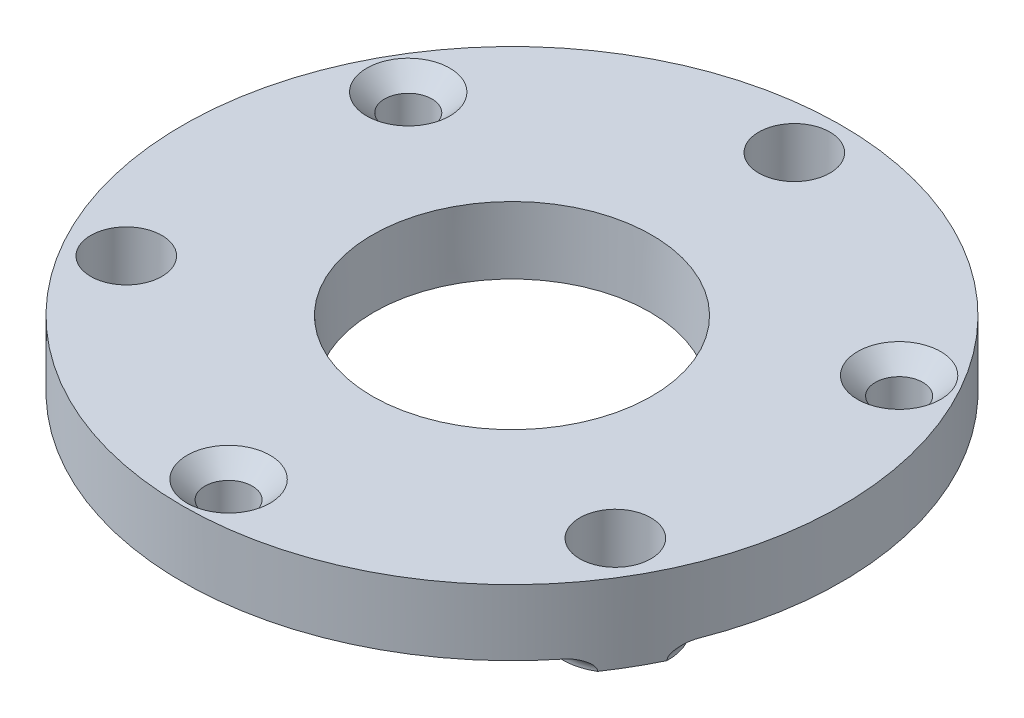
ISO-10303-21;
HEADER;
FILE_DESCRIPTION(('STEP AP214'),'2;1');
FILE_NAME('part.step','',(''),(''),'','','');
FILE_SCHEMA(('AUTOMOTIVE_DESIGN { 1 0 10303 214 1 1 1 1 }'));
ENDSEC;
DATA;
#1=APPLICATION_CONTEXT('core data for automotive mechanical design processes');
#2=APPLICATION_PROTOCOL_DEFINITION('international standard','automotive_design',2000,#1);
#3=PRODUCT_CONTEXT('',#1,'mechanical');
#4=PRODUCT('Part','Part','',(#3));
#5=PRODUCT_RELATED_PRODUCT_CATEGORY('part','',(#4));
#6=PRODUCT_DEFINITION_FORMATION('','',#4);
#7=PRODUCT_DEFINITION_CONTEXT('part definition',#1,'design');
#8=PRODUCT_DEFINITION('design','',#6,#7);
#9=PRODUCT_DEFINITION_SHAPE('','',#8);
#10=(LENGTH_UNIT() NAMED_UNIT(*) SI_UNIT(.MILLI.,.METRE.));
#11=(NAMED_UNIT(*) PLANE_ANGLE_UNIT() SI_UNIT($,.RADIAN.));
#12=(NAMED_UNIT(*) SI_UNIT($,.STERADIAN.) SOLID_ANGLE_UNIT());
#13=UNCERTAINTY_MEASURE_WITH_UNIT(LENGTH_MEASURE(1.E-05),#10,'distance_accuracy_value','');
#14=(GEOMETRIC_REPRESENTATION_CONTEXT(3) GLOBAL_UNCERTAINTY_ASSIGNED_CONTEXT((#13)) GLOBAL_UNIT_ASSIGNED_CONTEXT((#10,
#11,#12)) REPRESENTATION_CONTEXT('',''));
#15=CARTESIAN_POINT('',(0.,0.,0.));
#16=DIRECTION('',(0.,0.,1.));
#17=DIRECTION('',(1.,0.,0.));
#18=AXIS2_PLACEMENT_3D('',#15,#16,#17);
#19=CARTESIAN_POINT('',(0.,0.,0.));
#20=DIRECTION('',(0.,1.,0.));
#21=DIRECTION('',(0.,0.,1.));
#22=AXIS2_PLACEMENT_3D('',#19,#20,#21);
#23=PLANE('',#22);
#24=CARTESIAN_POINT('',(-18.6195461813654,0.,-10.7500000000001));
#25=DIRECTION('',(0.,1.,0.));
#26=DIRECTION('',(0.,0.,1.));
#27=AXIS2_PLACEMENT_3D('',#24,#25,#26);
#28=CIRCLE('',#27,1.8);
#29=CARTESIAN_POINT('',(-18.6195461813654,0.,-8.95000000000009));
#30=VERTEX_POINT('',#29);
#31=EDGE_CURVE('E139',#30,#30,#28,.T.);
#32=ORIENTED_EDGE('',*,*,#31,.T.);
#33=EDGE_LOOP('',(#32));
#34=FACE_BOUND('',#33,.T.);
#35=CARTESIAN_POINT('',(18.6195461813655,0.,-10.7499999999998));
#36=DIRECTION('',(0.,1.,0.));
#37=DIRECTION('',(0.,0.,1.));
#38=AXIS2_PLACEMENT_3D('',#35,#36,#37);
#39=CIRCLE('',#38,1.8);
#40=CARTESIAN_POINT('',(18.6195461813655,0.,-8.94999999999983));
#41=VERTEX_POINT('',#40);
#42=EDGE_CURVE('E148',#41,#41,#39,.T.);
#43=ORIENTED_EDGE('',*,*,#42,.T.);
#44=EDGE_LOOP('',(#43));
#45=FACE_BOUND('',#44,.T.);
#46=CARTESIAN_POINT('',(0.,0.,21.5));
#47=DIRECTION('',(0.,1.,0.));
#48=DIRECTION('',(0.,0.,1.));
#49=AXIS2_PLACEMENT_3D('',#46,#47,#48);
#50=CIRCLE('',#49,1.8);
#51=CARTESIAN_POINT('',(0.,0.,23.3));
#52=VERTEX_POINT('',#51);
#53=EDGE_CURVE('E157',#52,#52,#50,.T.);
#54=ORIENTED_EDGE('',*,*,#53,.T.);
#55=EDGE_LOOP('',(#54));
#56=FACE_BOUND('',#55,.T.);
#57=CARTESIAN_POINT('',(0.,0.,0.));
#58=DIRECTION('',(0.,1.,0.));
#59=DIRECTION('',(0.,0.,1.));
#60=AXIS2_PLACEMENT_3D('',#57,#58,#59);
#61=CIRCLE('',#60,10.4690703921541);
#62=CARTESIAN_POINT('',(0.,0.,10.4690703921541));
#63=VERTEX_POINT('',#62);
#64=EDGE_CURVE('E163',#63,#63,#61,.T.);
#65=ORIENTED_EDGE('',*,*,#64,.T.);
#66=EDGE_LOOP('',(#65));
#67=FACE_BOUND('',#66,.T.);
#68=CARTESIAN_POINT('',(0.,0.,0.));
#69=DIRECTION('',(0.,1.,0.));
#70=DIRECTION('',(0.,0.,1.));
#71=AXIS2_PLACEMENT_3D('',#68,#69,#70);
#72=CIRCLE('',#71,25.);
#73=CARTESIAN_POINT('',(-3.76018694612368,0.,-24.7156022408964));
#74=VERTEX_POINT('',#73);
#75=CARTESIAN_POINT('',(-23.2844328835088,0.,9.10138370212869));
#76=VERTEX_POINT('',#75);
#77=EDGE_CURVE('E170',#74,#76,#72,.T.);
#78=ORIENTED_EDGE('',*,*,#77,.F.);
#79=CARTESIAN_POINT('',(0.,0.,-21.42));
#80=DIRECTION('',(0.,1.,0.));
#81=DIRECTION('',(0.,0.,1.));
#82=AXIS2_PLACEMENT_3D('',#79,#80,#81);
#83=CIRCLE('',#82,5.);
#84=CARTESIAN_POINT('',(3.76018694612368,0.,-24.7156022408964));
#85=VERTEX_POINT('',#84);
#86=EDGE_CURVE('E184',#74,#85,#83,.T.);
#87=ORIENTED_EDGE('',*,*,#86,.T.);
#88=CARTESIAN_POINT('',(23.2844328835106,0.,9.10138370212421));
#89=VERTEX_POINT('',#88);
#90=EDGE_CURVE('E98',#89,#85,#72,.T.);
#91=ORIENTED_EDGE('',*,*,#90,.F.);
#92=CARTESIAN_POINT('',(18.550264149064,0.,10.7099999999992));
#93=DIRECTION('',(0.,1.,0.));
#94=DIRECTION('',(0.,0.,1.));
#95=AXIS2_PLACEMENT_3D('',#92,#93,#94);
#96=CIRCLE('',#95,5.);
#97=CARTESIAN_POINT('',(19.5242459373865,0.,15.6142185387693));
#98=VERTEX_POINT('',#97);
#99=EDGE_CURVE('E182',#89,#98,#96,.T.);
#100=ORIENTED_EDGE('',*,*,#99,.T.);
#101=CARTESIAN_POINT('',(-19.5242459373855,0.,15.6142185387705));
#102=VERTEX_POINT('',#101);
#103=EDGE_CURVE('E179',#102,#98,#72,.T.);
#104=ORIENTED_EDGE('',*,*,#103,.F.);
#105=CARTESIAN_POINT('',(-18.5502641490613,0.,10.7100000000008));
#106=DIRECTION('',(0.,1.,0.));
#107=DIRECTION('',(0.,0.,1.));
#108=AXIS2_PLACEMENT_3D('',#105,#106,#107);
#109=CIRCLE('',#108,5.);
#110=EDGE_CURVE('E55',#102,#76,#109,.T.);
#111=ORIENTED_EDGE('',*,*,#110,.T.);
#112=EDGE_LOOP('',(#78,#87,#91,#100,#104,#111));
#113=FACE_BOUND('',#112,.T.);
#114=ADVANCED_FACE('F34',(#34,#45,#56,#67,#113),#23,.F.);
#115=CARTESIAN_POINT('',(0.,5.,0.));
#116=DIRECTION('',(0.,-1.,0.));
#117=DIRECTION('',(0.,0.,-1.));
#118=AXIS2_PLACEMENT_3D('',#115,#116,#117);
#119=CYLINDRICAL_SURFACE('',#118,25.);
#120=CARTESIAN_POINT('',(0.,5.,0.));
#121=DIRECTION('',(0.,1.,0.));
#122=DIRECTION('',(0.,0.,1.));
#123=AXIS2_PLACEMENT_3D('',#120,#121,#122);
#124=CIRCLE('',#123,25.);
#125=CARTESIAN_POINT('',(0.,5.,25.));
#126=VERTEX_POINT('',#125);
#127=EDGE_CURVE('E176',#126,#126,#124,.T.);
#128=ORIENTED_EDGE('',*,*,#127,.F.);
#129=EDGE_LOOP('',(#128));
#130=FACE_BOUND('',#129,.T.);
#131=CARTESIAN_POINT('',(0.,-1.,0.));
#132=DIRECTION('',(0.,-1.,0.));
#133=DIRECTION('',(0.,0.,-1.));
#134=AXIS2_PLACEMENT_3D('',#131,#132,#133);
#135=CIRCLE('',#134,25.);
#136=CARTESIAN_POINT('',(-20.6231882535034,-1.,14.1309626798941));
#137=VERTEX_POINT('',#136);
#138=CARTESIAN_POINT('',(-22.5493667874685,-1.,10.7947235946186));
#139=VERTEX_POINT('',#138);
#140=EDGE_CURVE('E127',#137,#139,#135,.T.);
#141=ORIENTED_EDGE('',*,*,#140,.F.);
#142=CARTESIAN_POINT('',(-20.6231882535034,-1.,14.1309626798941));
#143=CARTESIAN_POINT('',(-20.6232350944953,-0.973586965462332,14.1308922829923));
#144=CARTESIAN_POINT('',(-20.621756593342,-0.947296299769171,14.1330522226527));
#145=CARTESIAN_POINT('',(-20.6162031936346,-0.89595550807268,14.1411528449473));
#146=CARTESIAN_POINT('',(-20.6121655302788,-0.870893054901191,14.1470393061422));
#147=CARTESIAN_POINT('',(-20.6003906441305,-0.814921682100689,14.164181377551));
#148=CARTESIAN_POINT('',(-20.5919072137914,-0.784512498212255,14.1765175616493));
#149=CARTESIAN_POINT('',(-20.5722910653188,-0.726290293248973,14.2049690124696));
#150=CARTESIAN_POINT('',(-20.5611415891279,-0.698495309685433,14.2211081739575));
#151=CARTESIAN_POINT('',(-20.5276601299499,-0.624903732852702,14.2694275116065));
#152=CARTESIAN_POINT('',(-20.5033562217446,-0.581841465922802,14.304349034202));
#153=CARTESIAN_POINT('',(-20.451427798709,-0.501997376217426,14.3784971630185));
#154=CARTESIAN_POINT('',(-20.4237955466699,-0.465230687827921,14.4177337811526));
#155=CARTESIAN_POINT('',(-20.3659035195638,-0.396294156106442,14.4993969639317));
#156=CARTESIAN_POINT('',(-20.3356132956352,-0.364193110367113,14.5418594570174));
#157=CARTESIAN_POINT('',(-20.2732949484417,-0.304407753229898,14.6286148489697));
#158=CARTESIAN_POINT('',(-20.241265265362,-0.276727496711786,14.6729093818948));
#159=CARTESIAN_POINT('',(-20.1757708502732,-0.225362999381766,14.7628374514195));
#160=CARTESIAN_POINT('',(-20.1423042219954,-0.201684255960819,14.808472730612));
#161=CARTESIAN_POINT('',(-20.0741837697407,-0.158178103946163,14.9006856824353));
#162=CARTESIAN_POINT('',(-20.0395297919102,-0.138351196700223,14.9472634768722));
#163=CARTESIAN_POINT('',(-19.9661577347922,-0.100966885076888,15.0451520789649));
#164=CARTESIAN_POINT('',(-19.9273468816714,-0.0837526053495929,15.0965246797792));
#165=CARTESIAN_POINT('',(-19.8486828355108,-0.0539238776380615,15.1998028194117));
#166=CARTESIAN_POINT('',(-19.8088296634221,-0.0413093372730208,15.2517083475051));
#167=CARTESIAN_POINT('',(-19.7285545066535,-0.0209652223238633,15.3554028092382));
#168=CARTESIAN_POINT('',(-19.6881391165556,-0.0131993718503745,15.4071896482652));
#169=CARTESIAN_POINT('',(-19.6066395058371,-0.00272378398616917,15.5107723323731));
#170=CARTESIAN_POINT('',(-19.5655550621591,-1.57691514504377E-05,15.5625681745161));
#171=CARTESIAN_POINT('',(-19.5242459373855,0.,15.6142185387705));
#172=B_SPLINE_CURVE_WITH_KNOTS('',3,(#142,#143,#144,#145,#146,#147,#148,#149,#150,#151,#152,
#153,#154,#155,#156,#157,#158,#159,#160,#161,#162,#163,#164,#165,#166,#167,#168,#169,#170,#171),
.UNSPECIFIED.,.F.,.F.,(4,2,2,2,2,2,2,2,2,2,2,2,2,2,4),(0.,0.0789131914609894,0.15670377488966,
0.257815060886303,0.359579433631892,0.540175523590869,0.721199845096693,0.904669272695562,
1.08830602925819,1.27219305556915,1.45610400025844,1.6558735925121,1.85563917238795,
2.05389169381441,2.25221172214837),.UNSPECIFIED.);
#173=EDGE_CURVE('E48',#137,#102,#172,.T.);
#174=ORIENTED_EDGE('',*,*,#173,.T.);
#175=ORIENTED_EDGE('',*,*,#103,.T.);
#176=CARTESIAN_POINT('',(19.5242459373865,0.,15.6142185387693));
#177=CARTESIAN_POINT('',(19.5696093242938,-2.30517781126259E-05,15.5575000242535));
#178=CARTESIAN_POINT('',(19.6146981633579,-0.00328449148192498,15.5006092070901));
#179=CARTESIAN_POINT('',(19.7040511677425,-0.015869955559491,15.3868631895834));
#180=CARTESIAN_POINT('',(19.7483155028982,-0.025192716865045,15.3300079842894));
#181=CARTESIAN_POINT('',(19.8362951543023,-0.0496348155225064,15.2159999409611));
#182=CARTESIAN_POINT('',(19.8799972333065,-0.0648233155385237,15.1588519013263));
#183=CARTESIAN_POINT('',(19.9660690893839,-0.100741961117756,15.0453034189345));
#184=CARTESIAN_POINT('',(20.0084390091742,-0.121471510780434,14.9889028964715));
#185=CARTESIAN_POINT('',(20.0815330085732,-0.162721365085316,14.8907628591254));
#186=CARTESIAN_POINT('',(20.112592808361,-0.182076948347779,14.8487801620131));
#187=CARTESIAN_POINT('',(20.1736792967498,-0.224002476220827,14.7656804927788));
#188=CARTESIAN_POINT('',(20.2037061712246,-0.246571838718848,14.7245633654206));
#189=CARTESIAN_POINT('',(20.2624083225683,-0.29499222447442,14.6436776073568));
#190=CARTESIAN_POINT('',(20.2910894893762,-0.320826665257542,14.6039033669227));
#191=CARTESIAN_POINT('',(20.3469697044659,-0.376196535897639,14.5259463575848));
#192=CARTESIAN_POINT('',(20.3741698919496,-0.405729061706216,14.4877623708944));
#193=CARTESIAN_POINT('',(20.4209470141076,-0.462241643682785,14.4217262524109));
#194=CARTESIAN_POINT('',(20.4408981816535,-0.488386934686066,14.3934289351388));
#195=CARTESIAN_POINT('',(20.4792697543877,-0.543854506452894,14.3387804489017));
#196=CARTESIAN_POINT('',(20.4976867860959,-0.573183478149497,14.3124335823179));
#197=CARTESIAN_POINT('',(20.5324937415285,-0.635969338170467,14.2624554978299));
#198=CARTESIAN_POINT('',(20.5488548429191,-0.66947406633759,14.2388631641068));
#199=CARTESIAN_POINT('',(20.5779778729234,-0.740960332839187,14.1967418195328));
#200=CARTESIAN_POINT('',(20.5907557414962,-0.778920943219733,14.178190396085));
#201=CARTESIAN_POINT('',(20.6065169090233,-0.842327836831803,14.1552664448495));
#202=CARTESIAN_POINT('',(20.6113596377518,-0.866328262276174,14.148211660954));
#203=CARTESIAN_POINT('',(20.6186916974234,-0.915394799101256,14.1375244419198));
#204=CARTESIAN_POINT('',(20.6211884516745,-0.940457284943744,14.1338812118127));
#205=CARTESIAN_POINT('',(20.6229216935211,-0.977103783533508,14.1313516216154));
#206=CARTESIAN_POINT('',(20.6231948202059,-0.988553009443518,14.1309528675404));
#207=CARTESIAN_POINT('',(20.6231882535033,-1.,14.1309626798943));
#208=B_SPLINE_CURVE_WITH_KNOTS('',3,(#176,#177,#178,#179,#180,#181,#182,#183,#184,#185,#186,
#187,#188,#189,#190,#191,#192,#193,#194,#195,#196,#197,#198,#199,#200,#201,#202,#203,#204,#205,
#206,#207),.UNSPECIFIED.,.F.,.F.,(4,2,2,2,2,2,2,2,2,2,2,2,2,2,2,4),(0.,0.217759075910336,
0.435472789362352,0.655836044212712,0.876175610087974,1.04316265600238,1.2101194938986,
1.37626012868431,1.54227110453312,1.67229016059185,1.80258796265945,1.93454616343114,
2.06590768517885,2.14205925753355,2.21796904576488,2.25230945301693),.UNSPECIFIED.);
#209=CARTESIAN_POINT('',(20.6231882535033,-1.,14.1309626798943));
#210=VERTEX_POINT('',#209);
#211=EDGE_CURVE('E211',#98,#210,#208,.T.);
#212=ORIENTED_EDGE('',*,*,#211,.T.);
#213=CARTESIAN_POINT('',(0.,-1.,0.));
#214=DIRECTION('',(0.,-1.,0.));
#215=DIRECTION('',(0.,0.,-1.));
#216=AXIS2_PLACEMENT_3D('',#213,#214,#215);
#217=CIRCLE('',#216,25.);
#218=CARTESIAN_POINT('',(22.5493667874713,-1.,10.7947235946126));
#219=VERTEX_POINT('',#218);
#220=EDGE_CURVE('E115',#219,#210,#217,.T.);
#221=ORIENTED_EDGE('',*,*,#220,.F.);
#222=CARTESIAN_POINT('',(22.5493667874713,-1.,10.7947235946126));
#223=CARTESIAN_POINT('',(22.5493292424619,-0.973586965462293,10.7947993585525));
#224=CARTESIAN_POINT('',(22.5504605545018,-0.947296299769093,10.792438969164));
#225=CARTESIAN_POINT('',(22.5546991993417,-0.895955508072528,10.7835792727927));
#226=CARTESIAN_POINT('',(22.557778192597,-0.870893054901003,10.7771393231572));
#227=CARTESIAN_POINT('',(22.5667362188363,-0.814921682100421,10.7583709369217));
#228=CARTESIAN_POINT('',(22.5731779524817,-0.784512498211945,10.7448559786877));
#229=CARTESIAN_POINT('',(22.5880095574303,-0.72629029324858,10.7136421703758));
#230=CARTESIAN_POINT('',(22.5964117431792,-0.698495309685,10.6959168600117));
#231=CARTESIAN_POINT('',(22.6215167874882,-0.624903732852202,10.6427613969831));
#232=CARTESIAN_POINT('',(22.6396077590921,-0.581841465922274,10.6042528337684));
#233=CARTESIAN_POINT('',(22.6778577107725,-0.501997376216846,10.5222074358327));
#234=CARTESIAN_POINT('',(22.6980214928157,-0.465230687827317,10.478658894536));
#235=CARTESIAN_POINT('',(22.7397978701032,-0.39629415610585,10.387691336996));
#236=CARTESIAN_POINT('',(22.7614263558591,-0.364193110366551,10.3402279870447));
#237=CARTESIAN_POINT('',(22.8053995556083,-0.30440775322939,10.2428810192772));
#238=CARTESIAN_POINT('',(22.8277449048304,-0.276727496711302,10.1929952335925));
#239=CARTESIAN_POINT('',(22.8728776900076,-0.225362999381333,10.0913113715573));
#240=CARTESIAN_POINT('',(22.8956656869581,-0.201684255960412,10.0395107816936));
#241=CARTESIAN_POINT('',(22.9414642196677,-0.158178103945807,9.93441026361216));
#242=CARTESIAN_POINT('',(22.964474783987,-0.13835119669989,9.8811101412503));
#243=CARTESIAN_POINT('',(23.0125627715811,-0.100966885076626,9.768623774812));
#244=CARTESIAN_POINT('',(23.0376473223844,-0.0837526053493738,9.7093262896598));
#245=CARTESIAN_POINT('',(23.0877567918813,-0.0539238776379178,9.58956215750422));
#246=CARTESIAN_POINT('',(23.1127817117626,-0.0413093372729101,9.5290955340074));
#247=CARTESIAN_POINT('',(23.1624461714708,-0.0209652223238061,9.40772797808668));
#248=CARTESIAN_POINT('',(23.1870871946009,-0.0131993718503381,9.3468338040447));
#249=CARTESIAN_POINT('',(23.2360426250711,-0.00272378398616113,9.22446172871019));
#250=CARTESIAN_POINT('',(23.2603569183384,-1.576915145004E-05,9.16298363571335));
#251=CARTESIAN_POINT('',(23.2844328835106,0.,9.10138370212421));
#252=B_SPLINE_CURVE_WITH_KNOTS('',3,(#222,#223,#224,#225,#226,#227,#228,#229,#230,#231,#232,
#233,#234,#235,#236,#237,#238,#239,#240,#241,#242,#243,#244,#245,#246,#247,#248,#249,#250,#251),
.UNSPECIFIED.,.F.,.F.,(4,2,2,2,2,2,2,2,2,2,2,2,2,2,4),(0.,0.078913191461104,0.156703774889888,
0.257815060886667,0.359579433632392,0.540175523591477,0.721199845097408,0.904669272696121,
1.0883060292586,1.2721930555694,1.45610400025854,1.65587359251181,1.85563917238726,
2.05389169381335,2.25221172214692),.UNSPECIFIED.);
#253=EDGE_CURVE('E102',#219,#89,#252,.T.);
#254=ORIENTED_EDGE('',*,*,#253,.T.);
#255=ORIENTED_EDGE('',*,*,#90,.T.);
#256=CARTESIAN_POINT('',(3.76018694612368,0.,-24.7156022408964));
#257=CARTESIAN_POINT('',(3.68838557823435,-2.30517781123426E-05,-24.7265288291019));
#258=CARTESIAN_POINT('',(3.61657226579671,-0.00328449148192666,-24.7371315005769));
#259=CARTESIAN_POINT('',(3.47338882286424,-0.0158699555594999,-24.7576404635251));
#260=CARTESIAN_POINT('',(3.40201860316437,-0.0251927168650594,-24.7675468996045));
#261=CARTESIAN_POINT('',(3.2592949157042,-0.0496348155225337,-24.7867354910725));
#262=CARTESIAN_POINT('',(3.18795222210185,-0.0648233155385585,-24.7960085818709));
#263=CARTESIAN_POINT('',(3.04658042375055,-0.100741961117809,-24.8137747545889));
#264=CARTESIAN_POINT('',(2.9765511786157,-0.121471510780498,-24.8222679202521));
#265=CARTESIAN_POINT('',(2.85501241344601,-0.162721365085396,-24.8364991619228));
#266=CARTESIAN_POINT('',(2.80312443133352,-0.182076948347865,-24.8424063890194));
#267=CARTESIAN_POINT('',(2.70061476253606,-0.224002476220924,-24.8537590051749));
#268=CARTESIAN_POINT('',(2.64999284847582,-0.24657183871895,-24.8592044775873));
#269=CARTESIAN_POINT('',(2.55059265151623,-0.294992224474536,-24.8695991528758));
#270=CARTESIAN_POINT('',(2.50180656548015,-0.320826665257664,-24.8745506517246));
#271=CARTESIAN_POINT('',(2.40635370744557,-0.376196535897776,-24.8839658328922));
#272=CARTESIAN_POINT('',(2.35968531121205,-0.40572906170636,-24.8884298928956));
#273=CARTESIAN_POINT('',(2.27910779395895,-0.462241643682924,-24.8959220097586));
#274=CARTESIAN_POINT('',(2.24462601456947,-0.488386934686191,-24.8990515690524));
#275=CARTESIAN_POINT('',(2.17811325084268,-0.543854506452996,-24.9049580827049));
#276=CARTESIAN_POINT('',(2.14608767921686,-0.57318347814959,-24.9077342667346));
#277=CARTESIAN_POINT('',(2.08540191070147,-0.635969338170534,-24.9128889321237));
#278=CARTESIAN_POINT('',(2.05678979966742,-0.66947406633764,-24.9152618947002));
#279=CARTESIAN_POINT('',(2.00575013022263,-0.740960332839205,-24.9194225062322));
#280=CARTESIAN_POINT('',(1.98329519195406,-0.778920943219738,-24.9212127532986));
#281=CARTESIAN_POINT('',(1.9555618840654,-0.842327836831776,-24.9234003491525));
#282=CARTESIAN_POINT('',(1.9470308976294,-0.866328262276127,-24.9240668833073));
#283=CARTESIAN_POINT('',(1.93410946461424,-0.915394799101168,-24.9250730237278));
#284=CARTESIAN_POINT('',(1.9297059576641,-0.940457284943636,-24.9254136612828));
#285=CARTESIAN_POINT('',(1.92664864736875,-0.977103783533423,-24.9256498976542));
#286=CARTESIAN_POINT('',(1.92616675286756,-0.988553009443475,-24.9256870552642));
#287=CARTESIAN_POINT('',(1.9261785339666,-1.,-24.9256862745098));
#288=B_SPLINE_CURVE_WITH_KNOTS('',3,(#256,#257,#258,#259,#260,#261,#262,#263,#264,#265,#266,
#267,#268,#269,#270,#271,#272,#273,#274,#275,#276,#277,#278,#279,#280,#281,#282,#283,#284,#285,
#286,#287),.UNSPECIFIED.,.F.,.F.,(4,2,2,2,2,2,2,2,2,2,2,2,2,2,2,4),(0.,0.217759075910458,
0.4354727893626,0.655836044213085,0.876175610088471,1.04316265600296,1.21011949389925,
1.37626012868504,1.54227110453392,1.67229016059263,1.8025879626602,1.93454616343187,
2.06590768517956,2.1420592575342,2.21796904576548,2.25230945301765),.UNSPECIFIED.);
#289=CARTESIAN_POINT('',(1.92617853396656,-1.,-24.9256862745098));
#290=VERTEX_POINT('',#289);
#291=EDGE_CURVE('E92',#85,#290,#288,.T.);
#292=ORIENTED_EDGE('',*,*,#291,.T.);
#293=CARTESIAN_POINT('',(0.,-1.,0.));
#294=DIRECTION('',(0.,-1.,0.));
#295=DIRECTION('',(0.,0.,-1.));
#296=AXIS2_PLACEMENT_3D('',#293,#294,#295);
#297=CIRCLE('',#296,25.);
#298=CARTESIAN_POINT('',(-1.92617853396656,-1.,-24.9256862745098));
#299=VERTEX_POINT('',#298);
#300=EDGE_CURVE('E96',#299,#290,#297,.T.);
#301=ORIENTED_EDGE('',*,*,#300,.F.);
#302=CARTESIAN_POINT('',(-1.92617853396656,-1.,-24.9256862745098));
#303=CARTESIAN_POINT('',(-1.92609414796523,-0.973586965462312,-24.9256916415478));
#304=CARTESIAN_POINT('',(-1.92870396115848,-0.947296299769132,-24.9254911918198));
#305=CARTESIAN_POINT('',(-1.93849600570573,-0.895955508072604,-24.924732117743));
#306=CARTESIAN_POINT('',(-1.94561266231684,-0.870893054901097,-24.9241786293025));
#307=CARTESIAN_POINT('',(-1.9663455747045,-0.814921682100555,-24.9225523144757));
#308=CARTESIAN_POINT('',(-1.98127073868892,-0.7845124982121,-24.9213735403401));
#309=CARTESIAN_POINT('',(-2.01571849211018,-0.726290293248776,-24.9186111828485));
#310=CARTESIAN_POINT('',(-2.03527015404986,-0.698495309685216,-24.9170250339723));
#311=CARTESIAN_POINT('',(-2.09385665753702,-0.624903732852451,-24.9121889085928));
#312=CARTESIAN_POINT('',(-2.13625153734616,-0.581841465922538,-24.9086018679735));
#313=CARTESIAN_POINT('',(-2.22642991206222,-0.501997376217137,-24.9007045988545));
#314=CARTESIAN_POINT('',(-2.27422594614453,-0.465230687827619,-24.8963926756919));
#315=CARTESIAN_POINT('',(-2.37389435053811,-0.396294156106146,-24.887088300931));
#316=CARTESIAN_POINT('',(-2.42581306022264,-0.364193110366832,-24.8820874440653));
#317=CARTESIAN_POINT('',(-2.53210460716533,-0.304407753229644,-24.8714958682501));
#318=CARTESIAN_POINT('',(-2.58647963946707,-0.276727496711544,-24.8659046154905));
#319=CARTESIAN_POINT('',(-2.69710683973308,-0.22536299938155,-24.8541488229799));
#320=CARTESIAN_POINT('',(-2.75336146496139,-0.201684255960616,-24.8479835123086));
#321=CARTESIAN_POINT('',(-2.86728044992567,-0.158178103945986,-24.8350959460504));
#322=CARTESIAN_POINT('',(-2.92494499207555,-0.138351196700057,-24.8283736181254));
#323=CARTESIAN_POINT('',(-3.04640503678766,-0.100966885076757,-24.8137758537796));
#324=CARTESIAN_POINT('',(-3.11030044071167,-0.0837526053494844,-24.8058509694417));
#325=CARTESIAN_POINT('',(-3.2390739563692,-0.0539238776379912,-24.7893649769184));
#326=CARTESIAN_POINT('',(-3.30395204833922,-0.0413093372729667,-24.7808038815148));
#327=CARTESIAN_POINT('',(-3.43389166481602,-0.0209652223238352,-24.763130787327));
#328=CARTESIAN_POINT('',(-3.49894807804395,-0.0131993718503564,-24.7540234523119));
#329=CARTESIAN_POINT('',(-3.62940311923272,-0.00272378398616477,-24.7352340610851));
#330=CARTESIAN_POINT('',(-3.69480185617791,-1.57691514497965E-05,-24.7255518102312));
#331=CARTESIAN_POINT('',(-3.76018694612368,0.,-24.7156022408964));
#332=B_SPLINE_CURVE_WITH_KNOTS('',3,(#302,#303,#304,#305,#306,#307,#308,#309,#310,#311,#312,
#313,#314,#315,#316,#317,#318,#319,#320,#321,#322,#323,#324,#325,#326,#327,#328,#329,#330,#331),
.UNSPECIFIED.,.F.,.F.,(4,2,2,2,2,2,2,2,2,2,2,2,2,2,4),(0.,0.0789131914610469,0.156703774889774,
0.257815060886483,0.35957943363214,0.540175523591172,0.721199845097051,0.90466927269584,
1.08830602925839,1.27219305556928,1.45610400025849,1.65587359251195,1.8556391723876,
2.05389169381388,2.25221172214764),.UNSPECIFIED.);
#333=EDGE_CURVE('E62',#299,#74,#332,.T.);
#334=ORIENTED_EDGE('',*,*,#333,.T.);
#335=ORIENTED_EDGE('',*,*,#77,.T.);
#336=CARTESIAN_POINT('',(-23.2844328835088,0.,9.10138370212869));
#337=CARTESIAN_POINT('',(-23.2579949025268,-2.30517781125067E-05,9.16902880485011));
#338=CARTESIAN_POINT('',(-23.2312704291533,-0.00328449148192873,9.23652229348857));
#339=CARTESIAN_POINT('',(-23.1774399906054,-0.0158699555595092,9.37077727394357));
#340=CARTESIAN_POINT('',(-23.1503341060612,-0.0251927168650742,9.43753891531707));
#341=CARTESIAN_POINT('',(-23.0955900700052,-0.0496348155225627,9.57073555011345));
#342=CARTESIAN_POINT('',(-23.067949455407,-0.0648233155385962,9.63715668054671));
#343=CARTESIAN_POINT('',(-23.0126495131331,-0.100741961117863,9.7684713356567));
#344=CARTESIAN_POINT('',(-22.9849901877886,-0.12147151078056,9.83336502378297));
#345=CARTESIAN_POINT('',(-22.9365454220179,-0.162721365085474,9.94573630279993));
#346=CARTESIAN_POINT('',(-22.9157172396932,-0.182076948347949,9.99362622700874));
#347=CARTESIAN_POINT('',(-22.8742940592845,-0.22400247622102,10.0880785123987));
#348=CARTESIAN_POINT('',(-22.8536990196991,-0.246571838719052,10.1346411121693));
#349=CARTESIAN_POINT('',(-22.8130009740832,-0.294992224474648,10.2259215455217));
#350=CARTESIAN_POINT('',(-22.7928960548551,-0.320826665257782,10.2706472848046));
#351=CARTESIAN_POINT('',(-22.7533234119102,-0.376196535897906,10.3580194753102));
#352=CARTESIAN_POINT('',(-22.7338552031603,-0.405729061706497,10.400667522004));
#353=CARTESIAN_POINT('',(-22.7000548080652,-0.46224164368306,10.4741957573506));
#354=CARTESIAN_POINT('',(-22.6855241962216,-0.488386934686317,10.5056226339165));
#355=CARTESIAN_POINT('',(-22.657383005229,-0.543854506453096,10.5661776338061));
#356=CARTESIAN_POINT('',(-22.6437744653114,-0.573183478149674,10.5953006844196));
#357=CARTESIAN_POINT('',(-22.6178956522286,-0.635969338170589,10.6504334342966));
#358=CARTESIAN_POINT('',(-22.6056446425852,-0.669474066337682,10.6763987305963));
#359=CARTESIAN_POINT('',(-22.5837280031447,-0.74096033283922,10.7226806867022));
#360=CARTESIAN_POINT('',(-22.5740509334489,-0.778920943219738,10.7430223572164));
#361=CARTESIAN_POINT('',(-22.5620787930873,-0.84232783683174,10.768133904306));
#362=CARTESIAN_POINT('',(-22.5583905353798,-0.866328262276071,10.7758552223563));
#363=CARTESIAN_POINT('',(-22.5528011620362,-0.915394799101073,10.787548581811));
#364=CARTESIAN_POINT('',(-22.5508944093372,-0.940457284943522,10.791532449473));
#365=CARTESIAN_POINT('',(-22.5495703408885,-0.977103783533335,10.7942982760418));
#366=CARTESIAN_POINT('',(-22.5493615730721,-0.988553009443431,10.7947341877267));
#367=CARTESIAN_POINT('',(-22.5493667874685,-1.,10.7947235946185));
#368=B_SPLINE_CURVE_WITH_KNOTS('',3,(#336,#337,#338,#339,#340,#341,#342,#343,#344,#345,#346,
#347,#348,#349,#350,#351,#352,#353,#354,#355,#356,#357,#358,#359,#360,#361,#362,#363,#364,#365,
#366,#367),.UNSPECIFIED.,.F.,.F.,(4,2,2,2,2,2,2,2,2,2,2,2,2,2,2,4),(0.,0.21775907591058,
0.435472789362849,0.655836044213458,0.876175610088967,1.04316265600353,1.21011949389989,
1.37626012868575,1.54227110453471,1.67229016059339,1.80258796266094,1.93454616343259,
2.06590768518025,2.14205925753485,2.21796904576606,2.25230945301837),.UNSPECIFIED.);
#369=EDGE_CURVE('E11',#76,#139,#368,.T.);
#370=ORIENTED_EDGE('',*,*,#369,.T.);
#371=EDGE_LOOP('',(#141,#174,#175,#212,#221,#254,#255,#292,#301,#334,#335,#370));
#372=FACE_BOUND('',#371,.T.);
#373=ADVANCED_FACE('F95',(#130,#372),#119,.T.);
#374=CARTESIAN_POINT('',(0.,5.,0.));
#375=DIRECTION('',(0.,1.,0.));
#376=DIRECTION('',(0.,0.,1.));
#377=AXIS2_PLACEMENT_3D('',#374,#375,#376);
#378=PLANE('',#377);
#379=CARTESIAN_POINT('',(-18.6195461813654,5.,-10.7500000000001));
#380=DIRECTION('',(0.,1.,0.));
#381=DIRECTION('',(0.,0.,1.));
#382=AXIS2_PLACEMENT_3D('',#379,#380,#381);
#383=CIRCLE('',#382,3.15);
#384=CARTESIAN_POINT('',(-18.6195461813654,5.,-7.60000000000009));
#385=VERTEX_POINT('',#384);
#386=EDGE_CURVE('E133',#385,#385,#383,.T.);
#387=ORIENTED_EDGE('',*,*,#386,.F.);
#388=EDGE_LOOP('',(#387));
#389=FACE_BOUND('',#388,.T.);
#390=CARTESIAN_POINT('',(18.6195461813655,5.,-10.7499999999998));
#391=DIRECTION('',(0.,1.,0.));
#392=DIRECTION('',(0.,0.,1.));
#393=AXIS2_PLACEMENT_3D('',#390,#391,#392);
#394=CIRCLE('',#393,3.15);
#395=CARTESIAN_POINT('',(18.6195461813655,5.,-7.59999999999983));
#396=VERTEX_POINT('',#395);
#397=EDGE_CURVE('E142',#396,#396,#394,.T.);
#398=ORIENTED_EDGE('',*,*,#397,.F.);
#399=EDGE_LOOP('',(#398));
#400=FACE_BOUND('',#399,.T.);
#401=CARTESIAN_POINT('',(0.,5.,21.5));
#402=DIRECTION('',(0.,1.,0.));
#403=DIRECTION('',(0.,0.,1.));
#404=AXIS2_PLACEMENT_3D('',#401,#402,#403);
#405=CIRCLE('',#404,3.15);
#406=CARTESIAN_POINT('',(0.,5.,24.65));
#407=VERTEX_POINT('',#406);
#408=EDGE_CURVE('E151',#407,#407,#405,.T.);
#409=ORIENTED_EDGE('',*,*,#408,.F.);
#410=EDGE_LOOP('',(#409));
#411=FACE_BOUND('',#410,.T.);
#412=CARTESIAN_POINT('',(0.,5.,0.));
#413=DIRECTION('',(0.,1.,0.));
#414=DIRECTION('',(0.,0.,1.));
#415=AXIS2_PLACEMENT_3D('',#412,#413,#414);
#416=CIRCLE('',#415,10.6);
#417=CARTESIAN_POINT('',(0.,5.,10.6));
#418=VERTEX_POINT('',#417);
#419=EDGE_CURVE('E160',#418,#418,#416,.T.);
#420=ORIENTED_EDGE('',*,*,#419,.F.);
#421=EDGE_LOOP('',(#420));
#422=FACE_BOUND('',#421,.T.);
#423=CARTESIAN_POINT('',(0.,5.,-21.42));
#424=DIRECTION('',(0.,1.,0.));
#425=DIRECTION('',(0.,0.,1.));
#426=AXIS2_PLACEMENT_3D('',#423,#424,#425);
#427=CIRCLE('',#426,2.7);
#428=CARTESIAN_POINT('',(0.,5.,-18.72));
#429=VERTEX_POINT('',#428);
#430=EDGE_CURVE('E167',#429,#429,#427,.T.);
#431=ORIENTED_EDGE('',*,*,#430,.F.);
#432=EDGE_LOOP('',(#431));
#433=FACE_BOUND('',#432,.T.);
#434=CARTESIAN_POINT('',(18.550264149064,5.,10.7099999999992));
#435=DIRECTION('',(0.,1.,0.));
#436=DIRECTION('',(0.,0.,1.));
#437=AXIS2_PLACEMENT_3D('',#434,#435,#436);
#438=CIRCLE('',#437,2.7);
#439=CARTESIAN_POINT('',(18.550264149064,5.,13.4099999999992));
#440=VERTEX_POINT('',#439);
#441=EDGE_CURVE('E171',#440,#440,#438,.T.);
#442=ORIENTED_EDGE('',*,*,#441,.F.);
#443=EDGE_LOOP('',(#442));
#444=FACE_BOUND('',#443,.T.);
#445=CARTESIAN_POINT('',(-18.5502641490613,5.,10.7100000000008));
#446=DIRECTION('',(0.,1.,0.));
#447=DIRECTION('',(0.,0.,1.));
#448=AXIS2_PLACEMENT_3D('',#445,#446,#447);
#449=CIRCLE('',#448,2.7);
#450=CARTESIAN_POINT('',(-18.5502641490613,5.,13.4100000000008));
#451=VERTEX_POINT('',#450);
#452=EDGE_CURVE('E166',#451,#451,#449,.T.);
#453=ORIENTED_EDGE('',*,*,#452,.F.);
#454=EDGE_LOOP('',(#453));
#455=FACE_BOUND('',#454,.T.);
#456=ORIENTED_EDGE('',*,*,#127,.T.);
#457=EDGE_LOOP('',(#456));
#458=FACE_BOUND('',#457,.T.);
#459=ADVANCED_FACE('F238',(#389,#400,#411,#422,#433,#444,#455,#458),#378,.T.);
#460=CARTESIAN_POINT('',(-18.5502641490613,0.,10.7100000000008));
#461=DIRECTION('',(0.,1.,0.));
#462=DIRECTION('',(0.,0.,1.));
#463=AXIS2_PLACEMENT_3D('',#460,#461,#462);
#464=CYLINDRICAL_SURFACE('',#463,2.7);
#465=ORIENTED_EDGE('',*,*,#452,.T.);
#466=EDGE_LOOP('',(#465));
#467=FACE_BOUND('',#466,.T.);
#468=CARTESIAN_POINT('',(-18.5502641490613,-1.,10.7100000000008));
#469=DIRECTION('',(0.,-1.,0.));
#470=DIRECTION('',(0.,0.,-1.));
#471=AXIS2_PLACEMENT_3D('',#468,#469,#470);
#472=CIRCLE('',#471,2.7);
#473=CARTESIAN_POINT('',(-18.5502641490613,-1.,8.01000000000079));
#474=VERTEX_POINT('',#473);
#475=EDGE_CURVE('E124',#474,#474,#472,.T.);
#476=ORIENTED_EDGE('',*,*,#475,.T.);
#477=EDGE_LOOP('',(#476));
#478=FACE_BOUND('',#477,.T.);
#479=ADVANCED_FACE('F235',(#467,#478),#464,.F.);
#480=CARTESIAN_POINT('',(18.550264149064,0.,10.7099999999992));
#481=DIRECTION('',(0.,1.,0.));
#482=DIRECTION('',(0.,0.,1.));
#483=AXIS2_PLACEMENT_3D('',#480,#481,#482);
#484=CYLINDRICAL_SURFACE('',#483,2.7);
#485=ORIENTED_EDGE('',*,*,#441,.T.);
#486=EDGE_LOOP('',(#485));
#487=FACE_BOUND('',#486,.T.);
#488=CARTESIAN_POINT('',(18.550264149064,-1.,10.7099999999992));
#489=DIRECTION('',(0.,-1.,0.));
#490=DIRECTION('',(0.,0.,-1.));
#491=AXIS2_PLACEMENT_3D('',#488,#489,#490);
#492=CIRCLE('',#491,2.7);
#493=CARTESIAN_POINT('',(18.550264149064,-1.,8.00999999999921));
#494=VERTEX_POINT('',#493);
#495=EDGE_CURVE('E112',#494,#494,#492,.T.);
#496=ORIENTED_EDGE('',*,*,#495,.T.);
#497=EDGE_LOOP('',(#496));
#498=FACE_BOUND('',#497,.T.);
#499=ADVANCED_FACE('F237',(#487,#498),#484,.F.);
#500=CARTESIAN_POINT('',(0.,0.,-21.42));
#501=DIRECTION('',(0.,1.,0.));
#502=DIRECTION('',(0.,0.,1.));
#503=AXIS2_PLACEMENT_3D('',#500,#501,#502);
#504=CYLINDRICAL_SURFACE('',#503,2.7);
#505=ORIENTED_EDGE('',*,*,#430,.T.);
#506=EDGE_LOOP('',(#505));
#507=FACE_BOUND('',#506,.T.);
#508=CARTESIAN_POINT('',(0.,-1.,-21.42));
#509=DIRECTION('',(0.,-1.,0.));
#510=DIRECTION('',(0.,0.,-1.));
#511=AXIS2_PLACEMENT_3D('',#508,#509,#510);
#512=CIRCLE('',#511,2.7);
#513=CARTESIAN_POINT('',(0.,-1.,-24.12));
#514=VERTEX_POINT('',#513);
#515=EDGE_CURVE('E109',#514,#514,#512,.T.);
#516=ORIENTED_EDGE('',*,*,#515,.T.);
#517=EDGE_LOOP('',(#516));
#518=FACE_BOUND('',#517,.T.);
#519=ADVANCED_FACE('F245',(#507,#518),#504,.F.);
#520=CARTESIAN_POINT('',(0.,5.,0.));
#521=DIRECTION('',(0.,1.,0.));
#522=DIRECTION('',(0.,0.,1.));
#523=AXIS2_PLACEMENT_3D('',#520,#521,#522);
#524=CONICAL_SURFACE('',#523,10.6,0.026179938779915);
#525=ORIENTED_EDGE('',*,*,#64,.F.);
#526=EDGE_LOOP('',(#525));
#527=FACE_BOUND('',#526,.T.);
#528=ORIENTED_EDGE('',*,*,#419,.T.);
#529=EDGE_LOOP('',(#528));
#530=FACE_BOUND('',#529,.T.);
#531=ADVANCED_FACE('F264',(#527,#530),#524,.F.);
#532=CARTESIAN_POINT('',(0.,5.,21.5));
#533=DIRECTION('',(0.,1.,0.));
#534=DIRECTION('',(0.,0.,1.));
#535=AXIS2_PLACEMENT_3D('',#532,#533,#534);
#536=CYLINDRICAL_SURFACE('',#535,1.79999999999999);
#537=ORIENTED_EDGE('',*,*,#53,.F.);
#538=EDGE_LOOP('',(#537));
#539=FACE_BOUND('',#538,.T.);
#540=CARTESIAN_POINT('',(0.,3.65,21.5));
#541=DIRECTION('',(0.,1.,0.));
#542=DIRECTION('',(0.,0.,1.));
#543=AXIS2_PLACEMENT_3D('',#540,#541,#542);
#544=CIRCLE('',#543,1.79999999999999);
#545=CARTESIAN_POINT('',(0.,3.65,23.3));
#546=VERTEX_POINT('',#545);
#547=EDGE_CURVE('E154',#546,#546,#544,.T.);
#548=ORIENTED_EDGE('',*,*,#547,.T.);
#549=EDGE_LOOP('',(#548));
#550=FACE_BOUND('',#549,.T.);
#551=ADVANCED_FACE('F267',(#539,#550),#536,.F.);
#552=CARTESIAN_POINT('',(0.,5.,21.5));
#553=DIRECTION('',(0.,1.,0.));
#554=DIRECTION('',(0.,0.,1.));
#555=AXIS2_PLACEMENT_3D('',#552,#553,#554);
#556=CONICAL_SURFACE('',#555,3.15,0.785398163397451);
#557=ORIENTED_EDGE('',*,*,#547,.F.);
#558=EDGE_LOOP('',(#557));
#559=FACE_BOUND('',#558,.T.);
#560=ORIENTED_EDGE('',*,*,#408,.T.);
#561=EDGE_LOOP('',(#560));
#562=FACE_BOUND('',#561,.T.);
#563=ADVANCED_FACE('F304',(#559,#562),#556,.F.);
#564=CARTESIAN_POINT('',(18.6195461813655,5.,-10.7499999999998));
#565=DIRECTION('',(0.,1.,0.));
#566=DIRECTION('',(0.,0.,1.));
#567=AXIS2_PLACEMENT_3D('',#564,#565,#566);
#568=CYLINDRICAL_SURFACE('',#567,1.79999999999999);
#569=ORIENTED_EDGE('',*,*,#42,.F.);
#570=EDGE_LOOP('',(#569));
#571=FACE_BOUND('',#570,.T.);
#572=CARTESIAN_POINT('',(18.6195461813655,3.65,-10.7499999999998));
#573=DIRECTION('',(0.,1.,0.));
#574=DIRECTION('',(0.,0.,1.));
#575=AXIS2_PLACEMENT_3D('',#572,#573,#574);
#576=CIRCLE('',#575,1.79999999999999);
#577=CARTESIAN_POINT('',(18.6195461813655,3.65,-8.94999999999984));
#578=VERTEX_POINT('',#577);
#579=EDGE_CURVE('E145',#578,#578,#576,.T.);
#580=ORIENTED_EDGE('',*,*,#579,.T.);
#581=EDGE_LOOP('',(#580));
#582=FACE_BOUND('',#581,.T.);
#583=ADVANCED_FACE('F300',(#571,#582),#568,.F.);
#584=CARTESIAN_POINT('',(18.6195461813655,5.,-10.7499999999998));
#585=DIRECTION('',(0.,1.,0.));
#586=DIRECTION('',(0.,0.,1.));
#587=AXIS2_PLACEMENT_3D('',#584,#585,#586);
#588=CONICAL_SURFACE('',#587,3.15,0.78539816339745);
#589=ORIENTED_EDGE('',*,*,#579,.F.);
#590=EDGE_LOOP('',(#589));
#591=FACE_BOUND('',#590,.T.);
#592=ORIENTED_EDGE('',*,*,#397,.T.);
#593=EDGE_LOOP('',(#592));
#594=FACE_BOUND('',#593,.T.);
#595=ADVANCED_FACE('F296',(#591,#594),#588,.F.);
#596=CARTESIAN_POINT('',(-18.6195461813654,5.,-10.7500000000001));
#597=DIRECTION('',(0.,1.,0.));
#598=DIRECTION('',(0.,0.,1.));
#599=AXIS2_PLACEMENT_3D('',#596,#597,#598);
#600=CYLINDRICAL_SURFACE('',#599,1.79999999999999);
#601=ORIENTED_EDGE('',*,*,#31,.F.);
#602=EDGE_LOOP('',(#601));
#603=FACE_BOUND('',#602,.T.);
#604=CARTESIAN_POINT('',(-18.6195461813654,3.65,-10.7500000000001));
#605=DIRECTION('',(0.,1.,0.));
#606=DIRECTION('',(0.,0.,1.));
#607=AXIS2_PLACEMENT_3D('',#604,#605,#606);
#608=CIRCLE('',#607,1.79999999999999);
#609=CARTESIAN_POINT('',(-18.6195461813654,3.65,-8.9500000000001));
#610=VERTEX_POINT('',#609);
#611=EDGE_CURVE('E136',#610,#610,#608,.T.);
#612=ORIENTED_EDGE('',*,*,#611,.T.);
#613=EDGE_LOOP('',(#612));
#614=FACE_BOUND('',#613,.T.);
#615=ADVANCED_FACE('F292',(#603,#614),#600,.F.);
#616=CARTESIAN_POINT('',(-18.6195461813654,5.,-10.7500000000001));
#617=DIRECTION('',(0.,1.,0.));
#618=DIRECTION('',(0.,0.,1.));
#619=AXIS2_PLACEMENT_3D('',#616,#617,#618);
#620=CONICAL_SURFACE('',#619,3.15,0.78539816339745);
#621=ORIENTED_EDGE('',*,*,#611,.F.);
#622=EDGE_LOOP('',(#621));
#623=FACE_BOUND('',#622,.T.);
#624=ORIENTED_EDGE('',*,*,#386,.T.);
#625=EDGE_LOOP('',(#624));
#626=FACE_BOUND('',#625,.T.);
#627=ADVANCED_FACE('F231',(#623,#626),#620,.F.);
#628=CARTESIAN_POINT('',(-9.27513207453065,-1.,5.3550000000004));
#629=DIRECTION('',(0.,-1.,0.));
#630=DIRECTION('',(0.,0.,-1.));
#631=AXIS2_PLACEMENT_3D('',#628,#629,#630);
#632=PLANE('',#631);
#633=ORIENTED_EDGE('',*,*,#140,.T.);
#634=CARTESIAN_POINT('',(-18.5502641490613,-1.,10.7100000000008));
#635=DIRECTION('',(0.,-1.,0.));
#636=DIRECTION('',(0.,0.,-1.));
#637=AXIS2_PLACEMENT_3D('',#634,#635,#636);
#638=CIRCLE('',#637,4.);
#639=EDGE_CURVE('E130',#139,#137,#638,.T.);
#640=ORIENTED_EDGE('',*,*,#639,.T.);
#641=EDGE_LOOP('',(#633,#640));
#642=FACE_BOUND('',#641,.T.);
#643=ORIENTED_EDGE('',*,*,#475,.F.);
#644=EDGE_LOOP('',(#643));
#645=FACE_BOUND('',#644,.T.);
#646=ADVANCED_FACE('F227',(#642,#645),#632,.T.);
#647=CARTESIAN_POINT('',(9.27513207453202,-1.,5.35499999999961));
#648=DIRECTION('',(0.,-1.,0.));
#649=DIRECTION('',(0.,0.,-1.));
#650=AXIS2_PLACEMENT_3D('',#647,#648,#649);
#651=PLANE('',#650);
#652=ORIENTED_EDGE('',*,*,#220,.T.);
#653=CARTESIAN_POINT('',(18.550264149064,-1.,10.7099999999992));
#654=DIRECTION('',(0.,-1.,0.));
#655=DIRECTION('',(0.,0.,-1.));
#656=AXIS2_PLACEMENT_3D('',#653,#654,#655);
#657=CIRCLE('',#656,4.);
#658=EDGE_CURVE('E121',#210,#219,#657,.T.);
#659=ORIENTED_EDGE('',*,*,#658,.T.);
#660=EDGE_LOOP('',(#652,#659));
#661=FACE_BOUND('',#660,.T.);
#662=ORIENTED_EDGE('',*,*,#495,.F.);
#663=EDGE_LOOP('',(#662));
#664=FACE_BOUND('',#663,.T.);
#665=ADVANCED_FACE('F230',(#661,#664),#651,.T.);
#666=CARTESIAN_POINT('',(0.,-1.,-10.71));
#667=DIRECTION('',(0.,-1.,0.));
#668=DIRECTION('',(0.,0.,-1.));
#669=AXIS2_PLACEMENT_3D('',#666,#667,#668);
#670=PLANE('',#669);
#671=ORIENTED_EDGE('',*,*,#300,.T.);
#672=CARTESIAN_POINT('',(0.,-1.,-21.42));
#673=DIRECTION('',(0.,-1.,0.));
#674=DIRECTION('',(0.,0.,-1.));
#675=AXIS2_PLACEMENT_3D('',#672,#673,#674);
#676=CIRCLE('',#675,4.);
#677=EDGE_CURVE('E108',#290,#299,#676,.T.);
#678=ORIENTED_EDGE('',*,*,#677,.T.);
#679=EDGE_LOOP('',(#671,#678));
#680=FACE_BOUND('',#679,.T.);
#681=ORIENTED_EDGE('',*,*,#515,.F.);
#682=EDGE_LOOP('',(#681));
#683=FACE_BOUND('',#682,.T.);
#684=ADVANCED_FACE('F106',(#680,#683),#670,.T.);
#685=CARTESIAN_POINT('',(0.,-1.,-21.42));
#686=DIRECTION('',(0.,1.,0.));
#687=DIRECTION('',(0.,0.,1.));
#688=AXIS2_PLACEMENT_3D('',#685,#686,#687);
#689=TOROIDAL_SURFACE('',#688,5.,1.);
#690=ORIENTED_EDGE('',*,*,#291,.F.);
#691=ORIENTED_EDGE('',*,*,#86,.F.);
#692=ORIENTED_EDGE('',*,*,#333,.F.);
#693=ORIENTED_EDGE('',*,*,#677,.F.);
#694=EDGE_LOOP('',(#690,#691,#692,#693));
#695=FACE_BOUND('',#694,.T.);
#696=ADVANCED_FACE('F111',(#695),#689,.F.);
#697=CARTESIAN_POINT('',(18.550264149064,-1.,10.7099999999992));
#698=DIRECTION('',(0.,1.,0.));
#699=DIRECTION('',(0.,0.,1.));
#700=AXIS2_PLACEMENT_3D('',#697,#698,#699);
#701=TOROIDAL_SURFACE('',#700,5.,1.);
#702=ORIENTED_EDGE('',*,*,#211,.F.);
#703=ORIENTED_EDGE('',*,*,#99,.F.);
#704=ORIENTED_EDGE('',*,*,#253,.F.);
#705=ORIENTED_EDGE('',*,*,#658,.F.);
#706=EDGE_LOOP('',(#702,#703,#704,#705));
#707=FACE_BOUND('',#706,.T.);
#708=ADVANCED_FACE('F200',(#707),#701,.F.);
#709=CARTESIAN_POINT('',(-18.5502641490613,-1.,10.7100000000008));
#710=DIRECTION('',(0.,1.,0.));
#711=DIRECTION('',(0.,0.,1.));
#712=AXIS2_PLACEMENT_3D('',#709,#710,#711);
#713=TOROIDAL_SURFACE('',#712,5.,1.);
#714=ORIENTED_EDGE('',*,*,#369,.F.);
#715=ORIENTED_EDGE('',*,*,#110,.F.);
#716=ORIENTED_EDGE('',*,*,#173,.F.);
#717=ORIENTED_EDGE('',*,*,#639,.F.);
#718=EDGE_LOOP('',(#714,#715,#716,#717));
#719=FACE_BOUND('',#718,.T.);
#720=ADVANCED_FACE('F36',(#719),#713,.F.);
#721=CLOSED_SHELL('',(#114,#373,#459,#479,#499,#519,#531,#551,#563,#583,#595,#615,#627,#646,
#665,#684,#696,#708,#720));
#722=MANIFOLD_SOLID_BREP('B2',#721);
#723=ADVANCED_BREP_SHAPE_REPRESENTATION('',(#18,#722),#14);
#724=SHAPE_DEFINITION_REPRESENTATION(#9,#723);
ENDSEC;
END-ISO-10303-21;
